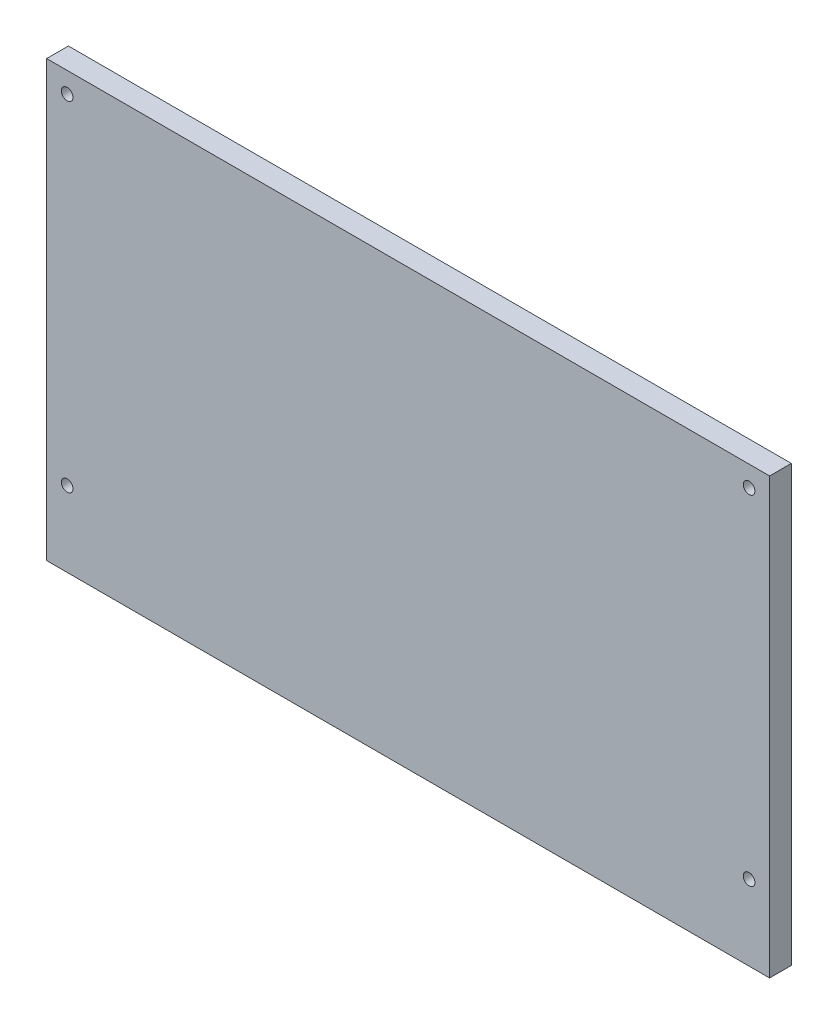
ISO-10303-21;
HEADER;
FILE_DESCRIPTION(('STEP AP214'),'2;1');
FILE_NAME('part.step','',(''),(''),'','','');
FILE_SCHEMA(('AUTOMOTIVE_DESIGN { 1 0 10303 214 1 1 1 1 }'));
ENDSEC;
DATA;
#1=APPLICATION_CONTEXT('core data for automotive mechanical design processes');
#2=APPLICATION_PROTOCOL_DEFINITION('international standard','automotive_design',2000,#1);
#3=PRODUCT_CONTEXT('',#1,'mechanical');
#4=PRODUCT('Part','Part','',(#3));
#5=PRODUCT_RELATED_PRODUCT_CATEGORY('part','',(#4));
#6=PRODUCT_DEFINITION_FORMATION('','',#4);
#7=PRODUCT_DEFINITION_CONTEXT('part definition',#1,'design');
#8=PRODUCT_DEFINITION('design','',#6,#7);
#9=PRODUCT_DEFINITION_SHAPE('','',#8);
#10=(LENGTH_UNIT() NAMED_UNIT(*) SI_UNIT(.MILLI.,.METRE.));
#11=(NAMED_UNIT(*) PLANE_ANGLE_UNIT() SI_UNIT($,.RADIAN.));
#12=(NAMED_UNIT(*) SI_UNIT($,.STERADIAN.) SOLID_ANGLE_UNIT());
#13=UNCERTAINTY_MEASURE_WITH_UNIT(LENGTH_MEASURE(1.E-05),#10,'distance_accuracy_value','');
#14=(GEOMETRIC_REPRESENTATION_CONTEXT(3) GLOBAL_UNCERTAINTY_ASSIGNED_CONTEXT((#13)) GLOBAL_UNIT_ASSIGNED_CONTEXT((#10,
#11,#12)) REPRESENTATION_CONTEXT('',''));
#15=CARTESIAN_POINT('',(0.,0.,0.));
#16=DIRECTION('',(0.,0.,1.));
#17=DIRECTION('',(1.,0.,0.));
#18=AXIS2_PLACEMENT_3D('',#15,#16,#17);
#19=CARTESIAN_POINT('',(0.,0.,6.35));
#20=DIRECTION('',(0.,0.,-1.));
#21=DIRECTION('',(-1.,0.,0.));
#22=AXIS2_PLACEMENT_3D('',#19,#20,#21);
#23=PLANE('',#22);
#24=CARTESIAN_POINT('',(5.99440000000001,21.9964,6.35));
#25=DIRECTION('',(0.,0.,1.));
#26=DIRECTION('',(1.,0.,0.));
#27=AXIS2_PLACEMENT_3D('',#24,#25,#26);
#28=CIRCLE('',#27,1.7);
#29=CARTESIAN_POINT('',(7.69440000000001,21.9964,6.35));
#30=VERTEX_POINT('',#29);
#31=EDGE_CURVE('E127',#30,#30,#28,.T.);
#32=ORIENTED_EDGE('',*,*,#31,.F.);
#33=EDGE_LOOP('',(#32));
#34=FACE_BOUND('',#33,.T.);
#35=CARTESIAN_POINT('',(205.1812,21.9964,6.35));
#36=DIRECTION('',(0.,0.,1.));
#37=DIRECTION('',(1.,0.,0.));
#38=AXIS2_PLACEMENT_3D('',#35,#36,#37);
#39=CIRCLE('',#38,1.70000000000001);
#40=CARTESIAN_POINT('',(206.8812,21.9964,6.35));
#41=VERTEX_POINT('',#40);
#42=EDGE_CURVE('E121',#41,#41,#39,.T.);
#43=ORIENTED_EDGE('',*,*,#42,.F.);
#44=EDGE_LOOP('',(#43));
#45=FACE_BOUND('',#44,.T.);
#46=CARTESIAN_POINT('',(205.1812,121.0056,6.35));
#47=DIRECTION('',(0.,0.,1.));
#48=DIRECTION('',(1.,0.,0.));
#49=AXIS2_PLACEMENT_3D('',#46,#47,#48);
#50=CIRCLE('',#49,1.70000000000001);
#51=CARTESIAN_POINT('',(206.8812,121.0056,6.35));
#52=VERTEX_POINT('',#51);
#53=EDGE_CURVE('E115',#52,#52,#50,.T.);
#54=ORIENTED_EDGE('',*,*,#53,.F.);
#55=EDGE_LOOP('',(#54));
#56=FACE_BOUND('',#55,.T.);
#57=DIRECTION('',(0.,-1.,0.));
#58=VECTOR('',#57,1.);
#59=CARTESIAN_POINT('',(0.,127.,6.35));
#60=LINE('',#59,#58);
#61=CARTESIAN_POINT('',(0.,127.,6.35));
#62=VERTEX_POINT('',#61);
#63=CARTESIAN_POINT('',(0.,0.,6.35));
#64=VERTEX_POINT('',#63);
#65=EDGE_CURVE('E86',#62,#64,#60,.T.);
#66=ORIENTED_EDGE('',*,*,#65,.T.);
#67=DIRECTION('',(1.,0.,0.));
#68=VECTOR('',#67,1.);
#69=CARTESIAN_POINT('',(211.1756,0.,6.35));
#70=LINE('',#69,#68);
#71=CARTESIAN_POINT('',(211.1756,0.,6.35));
#72=VERTEX_POINT('',#71);
#73=EDGE_CURVE('E81',#64,#72,#70,.T.);
#74=ORIENTED_EDGE('',*,*,#73,.T.);
#75=DIRECTION('',(0.,1.,0.));
#76=VECTOR('',#75,1.);
#77=CARTESIAN_POINT('',(211.1756,127.,6.35));
#78=LINE('',#77,#76);
#79=CARTESIAN_POINT('',(211.1756,127.,6.35));
#80=VERTEX_POINT('',#79);
#81=EDGE_CURVE('E84',#72,#80,#78,.T.);
#82=ORIENTED_EDGE('',*,*,#81,.T.);
#83=DIRECTION('',(-1.,0.,0.));
#84=VECTOR('',#83,1.);
#85=CARTESIAN_POINT('',(211.1756,127.,6.35));
#86=LINE('',#85,#84);
#87=EDGE_CURVE('E51',#80,#62,#86,.T.);
#88=ORIENTED_EDGE('',*,*,#87,.T.);
#89=EDGE_LOOP('',(#66,#74,#82,#88));
#90=FACE_BOUND('',#89,.T.);
#91=CARTESIAN_POINT('',(5.99440000000001,121.0056,6.35));
#92=DIRECTION('',(0.,0.,1.));
#93=DIRECTION('',(1.,0.,0.));
#94=AXIS2_PLACEMENT_3D('',#91,#92,#93);
#95=CIRCLE('',#94,1.7);
#96=CARTESIAN_POINT('',(7.69440000000001,121.0056,6.35));
#97=VERTEX_POINT('',#96);
#98=EDGE_CURVE('E133',#97,#97,#95,.T.);
#99=ORIENTED_EDGE('',*,*,#98,.F.);
#100=EDGE_LOOP('',(#99));
#101=FACE_BOUND('',#100,.T.);
#102=ADVANCED_FACE('F34',(#34,#45,#56,#90,#101),#23,.F.);
#103=CARTESIAN_POINT('',(0.,0.,0.));
#104=DIRECTION('',(0.,0.,-1.));
#105=DIRECTION('',(-1.,0.,0.));
#106=AXIS2_PLACEMENT_3D('',#103,#104,#105);
#107=PLANE('',#106);
#108=CARTESIAN_POINT('',(5.99440000000001,121.0056,0.));
#109=DIRECTION('',(0.,0.,1.));
#110=DIRECTION('',(1.,0.,0.));
#111=AXIS2_PLACEMENT_3D('',#108,#109,#110);
#112=CIRCLE('',#111,1.7);
#113=CARTESIAN_POINT('',(7.69440000000001,121.0056,0.));
#114=VERTEX_POINT('',#113);
#115=EDGE_CURVE('E130',#114,#114,#112,.T.);
#116=ORIENTED_EDGE('',*,*,#115,.T.);
#117=EDGE_LOOP('',(#116));
#118=FACE_BOUND('',#117,.T.);
#119=CARTESIAN_POINT('',(5.99440000000001,21.9964,0.));
#120=DIRECTION('',(0.,0.,1.));
#121=DIRECTION('',(1.,0.,0.));
#122=AXIS2_PLACEMENT_3D('',#119,#120,#121);
#123=CIRCLE('',#122,1.7);
#124=CARTESIAN_POINT('',(7.69440000000001,21.9964,0.));
#125=VERTEX_POINT('',#124);
#126=EDGE_CURVE('E124',#125,#125,#123,.T.);
#127=ORIENTED_EDGE('',*,*,#126,.T.);
#128=EDGE_LOOP('',(#127));
#129=FACE_BOUND('',#128,.T.);
#130=DIRECTION('',(0.,-1.,0.));
#131=VECTOR('',#130,1.);
#132=CARTESIAN_POINT('',(0.,127.,0.));
#133=LINE('',#132,#131);
#134=CARTESIAN_POINT('',(0.,127.,0.));
#135=VERTEX_POINT('',#134);
#136=CARTESIAN_POINT('',(0.,0.,0.));
#137=VERTEX_POINT('',#136);
#138=EDGE_CURVE('E98',#135,#137,#133,.T.);
#139=ORIENTED_EDGE('',*,*,#138,.F.);
#140=DIRECTION('',(-1.,0.,0.));
#141=VECTOR('',#140,1.);
#142=CARTESIAN_POINT('',(211.1756,127.,0.));
#143=LINE('',#142,#141);
#144=CARTESIAN_POINT('',(211.1756,127.,0.));
#145=VERTEX_POINT('',#144);
#146=EDGE_CURVE('E74',#145,#135,#143,.T.);
#147=ORIENTED_EDGE('',*,*,#146,.F.);
#148=DIRECTION('',(0.,1.,0.));
#149=VECTOR('',#148,1.);
#150=CARTESIAN_POINT('',(211.1756,127.,0.));
#151=LINE('',#150,#149);
#152=CARTESIAN_POINT('',(211.1756,0.,0.));
#153=VERTEX_POINT('',#152);
#154=EDGE_CURVE('E68',#153,#145,#151,.T.);
#155=ORIENTED_EDGE('',*,*,#154,.F.);
#156=DIRECTION('',(1.,0.,0.));
#157=VECTOR('',#156,1.);
#158=CARTESIAN_POINT('',(211.1756,0.,0.));
#159=LINE('',#158,#157);
#160=EDGE_CURVE('E90',#137,#153,#159,.T.);
#161=ORIENTED_EDGE('',*,*,#160,.F.);
#162=EDGE_LOOP('',(#139,#147,#155,#161));
#163=FACE_BOUND('',#162,.T.);
#164=CARTESIAN_POINT('',(205.1812,121.0056,0.));
#165=DIRECTION('',(0.,0.,1.));
#166=DIRECTION('',(1.,0.,0.));
#167=AXIS2_PLACEMENT_3D('',#164,#165,#166);
#168=CIRCLE('',#167,1.70000000000001);
#169=CARTESIAN_POINT('',(206.8812,121.0056,0.));
#170=VERTEX_POINT('',#169);
#171=EDGE_CURVE('E101',#170,#170,#168,.T.);
#172=ORIENTED_EDGE('',*,*,#171,.T.);
#173=EDGE_LOOP('',(#172));
#174=FACE_BOUND('',#173,.T.);
#175=CARTESIAN_POINT('',(205.1812,21.9964,0.));
#176=DIRECTION('',(0.,0.,1.));
#177=DIRECTION('',(1.,0.,0.));
#178=AXIS2_PLACEMENT_3D('',#175,#176,#177);
#179=CIRCLE('',#178,1.70000000000001);
#180=CARTESIAN_POINT('',(206.8812,21.9964,0.));
#181=VERTEX_POINT('',#180);
#182=EDGE_CURVE('E118',#181,#181,#179,.T.);
#183=ORIENTED_EDGE('',*,*,#182,.T.);
#184=EDGE_LOOP('',(#183));
#185=FACE_BOUND('',#184,.T.);
#186=ADVANCED_FACE('F109',(#118,#129,#163,#174,#185),#107,.T.);
#187=CARTESIAN_POINT('',(0.,127.,6.35));
#188=DIRECTION('',(1.,0.,0.));
#189=DIRECTION('',(0.,1.,0.));
#190=AXIS2_PLACEMENT_3D('',#187,#188,#189);
#191=PLANE('',#190);
#192=ORIENTED_EDGE('',*,*,#138,.T.);
#193=DIRECTION('',(0.,0.,-1.));
#194=VECTOR('',#193,1.);
#195=CARTESIAN_POINT('',(0.,0.,6.35));
#196=LINE('',#195,#194);
#197=EDGE_CURVE('E11',#64,#137,#196,.T.);
#198=ORIENTED_EDGE('',*,*,#197,.F.);
#199=ORIENTED_EDGE('',*,*,#65,.F.);
#200=DIRECTION('',(0.,0.,-1.));
#201=VECTOR('',#200,1.);
#202=CARTESIAN_POINT('',(0.,127.,6.35));
#203=LINE('',#202,#201);
#204=EDGE_CURVE('E94',#62,#135,#203,.T.);
#205=ORIENTED_EDGE('',*,*,#204,.T.);
#206=EDGE_LOOP('',(#192,#198,#199,#205));
#207=FACE_BOUND('',#206,.T.);
#208=ADVANCED_FACE('F36',(#207),#191,.F.);
#209=CARTESIAN_POINT('',(211.1756,0.,6.35));
#210=DIRECTION('',(0.,1.,0.));
#211=DIRECTION('',(-1.,0.,0.));
#212=AXIS2_PLACEMENT_3D('',#209,#210,#211);
#213=PLANE('',#212);
#214=ORIENTED_EDGE('',*,*,#160,.T.);
#215=DIRECTION('',(0.,0.,-1.));
#216=VECTOR('',#215,1.);
#217=CARTESIAN_POINT('',(211.1756,0.,6.35));
#218=LINE('',#217,#216);
#219=EDGE_CURVE('E43',#72,#153,#218,.T.);
#220=ORIENTED_EDGE('',*,*,#219,.F.);
#221=ORIENTED_EDGE('',*,*,#73,.F.);
#222=ORIENTED_EDGE('',*,*,#197,.T.);
#223=EDGE_LOOP('',(#214,#220,#221,#222));
#224=FACE_BOUND('',#223,.T.);
#225=ADVANCED_FACE('F89',(#224),#213,.F.);
#226=CARTESIAN_POINT('',(211.1756,127.,6.35));
#227=DIRECTION('',(-1.,0.,0.));
#228=DIRECTION('',(0.,-1.,0.));
#229=AXIS2_PLACEMENT_3D('',#226,#227,#228);
#230=PLANE('',#229);
#231=ORIENTED_EDGE('',*,*,#154,.T.);
#232=DIRECTION('',(0.,0.,-1.));
#233=VECTOR('',#232,1.);
#234=CARTESIAN_POINT('',(211.1756,127.,6.35));
#235=LINE('',#234,#233);
#236=EDGE_CURVE('E91',#80,#145,#235,.T.);
#237=ORIENTED_EDGE('',*,*,#236,.F.);
#238=ORIENTED_EDGE('',*,*,#81,.F.);
#239=ORIENTED_EDGE('',*,*,#219,.T.);
#240=EDGE_LOOP('',(#231,#237,#238,#239));
#241=FACE_BOUND('',#240,.T.);
#242=ADVANCED_FACE('F92',(#241),#230,.F.);
#243=CARTESIAN_POINT('',(211.1756,127.,6.35));
#244=DIRECTION('',(0.,-1.,0.));
#245=DIRECTION('',(1.,0.,0.));
#246=AXIS2_PLACEMENT_3D('',#243,#244,#245);
#247=PLANE('',#246);
#248=ORIENTED_EDGE('',*,*,#146,.T.);
#249=ORIENTED_EDGE('',*,*,#204,.F.);
#250=ORIENTED_EDGE('',*,*,#87,.F.);
#251=ORIENTED_EDGE('',*,*,#236,.T.);
#252=EDGE_LOOP('',(#248,#249,#250,#251));
#253=FACE_BOUND('',#252,.T.);
#254=ADVANCED_FACE('F106',(#253),#247,.F.);
#255=CARTESIAN_POINT('',(205.1812,121.0056,6.35));
#256=DIRECTION('',(0.,0.,1.));
#257=DIRECTION('',(1.,0.,0.));
#258=AXIS2_PLACEMENT_3D('',#255,#256,#257);
#259=CYLINDRICAL_SURFACE('',#258,1.70000000000001);
#260=ORIENTED_EDGE('',*,*,#171,.F.);
#261=EDGE_LOOP('',(#260));
#262=FACE_BOUND('',#261,.T.);
#263=ORIENTED_EDGE('',*,*,#53,.T.);
#264=EDGE_LOOP('',(#263));
#265=FACE_BOUND('',#264,.T.);
#266=ADVANCED_FACE('F149',(#262,#265),#259,.F.);
#267=CARTESIAN_POINT('',(205.1812,21.9964,6.35));
#268=DIRECTION('',(0.,0.,1.));
#269=DIRECTION('',(1.,0.,0.));
#270=AXIS2_PLACEMENT_3D('',#267,#268,#269);
#271=CYLINDRICAL_SURFACE('',#270,1.70000000000001);
#272=ORIENTED_EDGE('',*,*,#182,.F.);
#273=EDGE_LOOP('',(#272));
#274=FACE_BOUND('',#273,.T.);
#275=ORIENTED_EDGE('',*,*,#42,.T.);
#276=EDGE_LOOP('',(#275));
#277=FACE_BOUND('',#276,.T.);
#278=ADVANCED_FACE('F178',(#274,#277),#271,.F.);
#279=CARTESIAN_POINT('',(5.99440000000001,21.9964,6.35));
#280=DIRECTION('',(0.,0.,1.));
#281=DIRECTION('',(1.,0.,0.));
#282=AXIS2_PLACEMENT_3D('',#279,#280,#281);
#283=CYLINDRICAL_SURFACE('',#282,1.7);
#284=ORIENTED_EDGE('',*,*,#126,.F.);
#285=EDGE_LOOP('',(#284));
#286=FACE_BOUND('',#285,.T.);
#287=ORIENTED_EDGE('',*,*,#31,.T.);
#288=EDGE_LOOP('',(#287));
#289=FACE_BOUND('',#288,.T.);
#290=ADVANCED_FACE('F187',(#286,#289),#283,.F.);
#291=CARTESIAN_POINT('',(5.99440000000001,121.0056,6.35));
#292=DIRECTION('',(0.,0.,1.));
#293=DIRECTION('',(1.,0.,0.));
#294=AXIS2_PLACEMENT_3D('',#291,#292,#293);
#295=CYLINDRICAL_SURFACE('',#294,1.7);
#296=ORIENTED_EDGE('',*,*,#115,.F.);
#297=EDGE_LOOP('',(#296));
#298=FACE_BOUND('',#297,.T.);
#299=ORIENTED_EDGE('',*,*,#98,.T.);
#300=EDGE_LOOP('',(#299));
#301=FACE_BOUND('',#300,.T.);
#302=ADVANCED_FACE('F137',(#298,#301),#295,.F.);
#303=CLOSED_SHELL('',(#102,#186,#208,#225,#242,#254,#266,#278,#290,#302));
#304=MANIFOLD_SOLID_BREP('B2',#303);
#305=ADVANCED_BREP_SHAPE_REPRESENTATION('',(#18,#304),#14);
#306=SHAPE_DEFINITION_REPRESENTATION(#9,#305);
ENDSEC;
END-ISO-10303-21;
